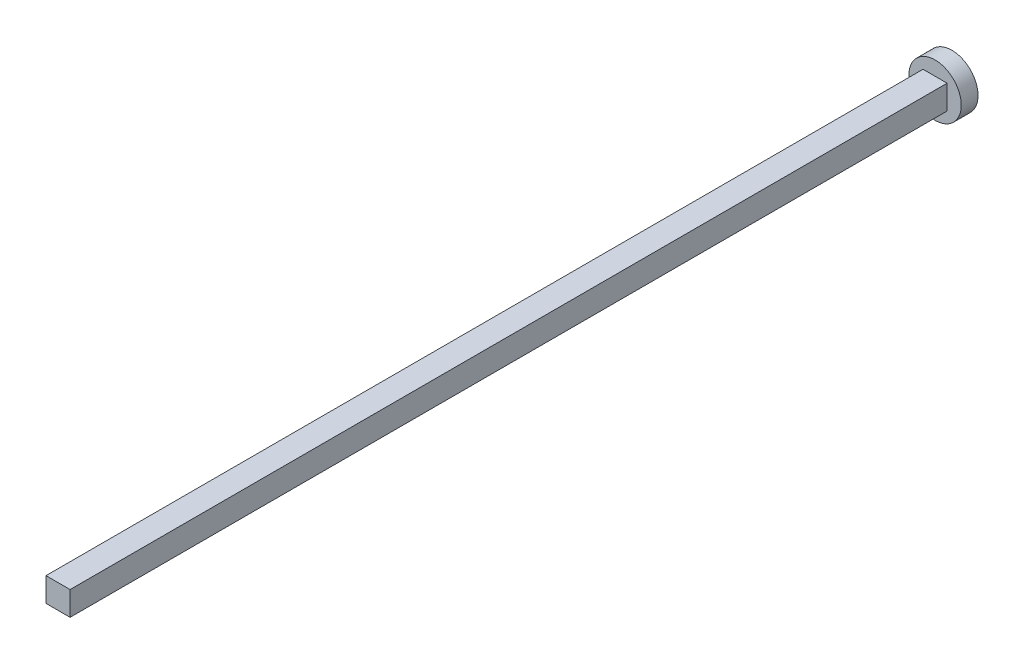
ISO-10303-21;
HEADER;
FILE_DESCRIPTION(('STEP AP214'),'2;1');
FILE_NAME('part.step','',(''),(''),'','','');
FILE_SCHEMA(('AUTOMOTIVE_DESIGN { 1 0 10303 214 1 1 1 1 }'));
ENDSEC;
DATA;
#1=APPLICATION_CONTEXT('core data for automotive mechanical design processes');
#2=APPLICATION_PROTOCOL_DEFINITION('international standard','automotive_design',2000,#1);
#3=PRODUCT_CONTEXT('',#1,'mechanical');
#4=PRODUCT('Part','Part','',(#3));
#5=PRODUCT_RELATED_PRODUCT_CATEGORY('part','',(#4));
#6=PRODUCT_DEFINITION_FORMATION('','',#4);
#7=PRODUCT_DEFINITION_CONTEXT('part definition',#1,'design');
#8=PRODUCT_DEFINITION('design','',#6,#7);
#9=PRODUCT_DEFINITION_SHAPE('','',#8);
#10=(LENGTH_UNIT() NAMED_UNIT(*) SI_UNIT(.MILLI.,.METRE.));
#11=(NAMED_UNIT(*) PLANE_ANGLE_UNIT() SI_UNIT($,.RADIAN.));
#12=(NAMED_UNIT(*) SI_UNIT($,.STERADIAN.) SOLID_ANGLE_UNIT());
#13=UNCERTAINTY_MEASURE_WITH_UNIT(LENGTH_MEASURE(1.E-05),#10,'distance_accuracy_value','');
#14=(GEOMETRIC_REPRESENTATION_CONTEXT(3) GLOBAL_UNCERTAINTY_ASSIGNED_CONTEXT((#13)) GLOBAL_UNIT_ASSIGNED_CONTEXT((#10,
#11,#12)) REPRESENTATION_CONTEXT('',''));
#15=CARTESIAN_POINT('',(0.,0.,0.));
#16=DIRECTION('',(0.,0.,1.));
#17=DIRECTION('',(1.,0.,0.));
#18=AXIS2_PLACEMENT_3D('',#15,#16,#17);
#19=CARTESIAN_POINT('',(1.43379802499999,-1.433798025,104.37));
#20=DIRECTION('',(-1.,0.,0.));
#21=DIRECTION('',(0.,0.,1.));
#22=AXIS2_PLACEMENT_3D('',#19,#20,#21);
#23=PLANE('',#22);
#24=DIRECTION('',(0.,1.,0.));
#25=VECTOR('',#24,1.);
#26=CARTESIAN_POINT('',(1.43379802499999,-1.433798025,0.));
#27=LINE('',#26,#25);
#28=CARTESIAN_POINT('',(1.43379802499999,-1.433798025,0.));
#29=VERTEX_POINT('',#28);
#30=CARTESIAN_POINT('',(1.43379802499999,1.433798025,0.));
#31=VERTEX_POINT('',#30);
#32=EDGE_CURVE('E77',#29,#31,#27,.T.);
#33=ORIENTED_EDGE('',*,*,#32,.T.);
#34=DIRECTION('',(0.,0.,-1.));
#35=VECTOR('',#34,1.);
#36=CARTESIAN_POINT('',(1.43379802499999,1.433798025,104.37));
#37=LINE('',#36,#35);
#38=CARTESIAN_POINT('',(1.43379802499999,1.433798025,104.37));
#39=VERTEX_POINT('',#38);
#40=EDGE_CURVE('E11',#39,#31,#37,.T.);
#41=ORIENTED_EDGE('',*,*,#40,.F.);
#42=DIRECTION('',(0.,1.,0.));
#43=VECTOR('',#42,1.);
#44=CARTESIAN_POINT('',(1.43379802499999,-1.433798025,104.37));
#45=LINE('',#44,#43);
#46=CARTESIAN_POINT('',(1.43379802499999,-1.433798025,104.37));
#47=VERTEX_POINT('',#46);
#48=EDGE_CURVE('E103',#47,#39,#45,.T.);
#49=ORIENTED_EDGE('',*,*,#48,.F.);
#50=DIRECTION('',(0.,0.,-1.));
#51=VECTOR('',#50,1.);
#52=CARTESIAN_POINT('',(1.43379802499999,-1.433798025,104.37));
#53=LINE('',#52,#51);
#54=EDGE_CURVE('E91',#47,#29,#53,.T.);
#55=ORIENTED_EDGE('',*,*,#54,.T.);
#56=EDGE_LOOP('',(#33,#41,#49,#55));
#57=FACE_BOUND('',#56,.T.);
#58=ADVANCED_FACE('F37',(#57),#23,.F.);
#59=CARTESIAN_POINT('',(-1.43379802499999,1.433798025,104.37));
#60=DIRECTION('',(0.,-1.,0.));
#61=DIRECTION('',(0.,0.,-1.));
#62=AXIS2_PLACEMENT_3D('',#59,#60,#61);
#63=PLANE('',#62);
#64=DIRECTION('',(-1.,0.,0.));
#65=VECTOR('',#64,1.);
#66=CARTESIAN_POINT('',(-1.43379802499999,1.433798025,0.));
#67=LINE('',#66,#65);
#68=CARTESIAN_POINT('',(-1.43379802499999,1.433798025,0.));
#69=VERTEX_POINT('',#68);
#70=EDGE_CURVE('E73',#31,#69,#67,.T.);
#71=ORIENTED_EDGE('',*,*,#70,.T.);
#72=DIRECTION('',(0.,0.,-1.));
#73=VECTOR('',#72,1.);
#74=CARTESIAN_POINT('',(-1.43379802499999,1.433798025,104.37));
#75=LINE('',#74,#73);
#76=CARTESIAN_POINT('',(-1.43379802499999,1.433798025,104.37));
#77=VERTEX_POINT('',#76);
#78=EDGE_CURVE('E45',#77,#69,#75,.T.);
#79=ORIENTED_EDGE('',*,*,#78,.F.);
#80=DIRECTION('',(-1.,0.,0.));
#81=VECTOR('',#80,1.);
#82=CARTESIAN_POINT('',(-1.43379802499999,1.433798025,104.37));
#83=LINE('',#82,#81);
#84=EDGE_CURVE('E87',#39,#77,#83,.T.);
#85=ORIENTED_EDGE('',*,*,#84,.F.);
#86=ORIENTED_EDGE('',*,*,#40,.T.);
#87=EDGE_LOOP('',(#71,#79,#85,#86));
#88=FACE_BOUND('',#87,.T.);
#89=ADVANCED_FACE('F86',(#88),#63,.F.);
#90=CARTESIAN_POINT('',(-1.43379802499999,-1.433798025,104.37));
#91=DIRECTION('',(1.,0.,0.));
#92=DIRECTION('',(0.,0.,-1.));
#93=AXIS2_PLACEMENT_3D('',#90,#91,#92);
#94=PLANE('',#93);
#95=DIRECTION('',(0.,-1.,0.));
#96=VECTOR('',#95,1.);
#97=CARTESIAN_POINT('',(-1.43379802499999,-1.433798025,0.));
#98=LINE('',#97,#96);
#99=CARTESIAN_POINT('',(-1.43379802499999,-1.433798025,0.));
#100=VERTEX_POINT('',#99);
#101=EDGE_CURVE('E80',#69,#100,#98,.T.);
#102=ORIENTED_EDGE('',*,*,#101,.T.);
#103=DIRECTION('',(0.,0.,-1.));
#104=VECTOR('',#103,1.);
#105=CARTESIAN_POINT('',(-1.43379802499999,-1.433798025,104.37));
#106=LINE('',#105,#104);
#107=CARTESIAN_POINT('',(-1.43379802499999,-1.433798025,104.37));
#108=VERTEX_POINT('',#107);
#109=EDGE_CURVE('E105',#108,#100,#106,.T.);
#110=ORIENTED_EDGE('',*,*,#109,.F.);
#111=DIRECTION('',(0.,-1.,0.));
#112=VECTOR('',#111,1.);
#113=CARTESIAN_POINT('',(-1.43379802499999,-1.433798025,104.37));
#114=LINE('',#113,#112);
#115=EDGE_CURVE('E111',#77,#108,#114,.T.);
#116=ORIENTED_EDGE('',*,*,#115,.F.);
#117=ORIENTED_EDGE('',*,*,#78,.T.);
#118=EDGE_LOOP('',(#102,#110,#116,#117));
#119=FACE_BOUND('',#118,.T.);
#120=ADVANCED_FACE('F109',(#119),#94,.F.);
#121=CARTESIAN_POINT('',(-1.43379802499999,-1.433798025,104.37));
#122=DIRECTION('',(0.,1.,0.));
#123=DIRECTION('',(0.,0.,1.));
#124=AXIS2_PLACEMENT_3D('',#121,#122,#123);
#125=PLANE('',#124);
#126=DIRECTION('',(1.,0.,0.));
#127=VECTOR('',#126,1.);
#128=CARTESIAN_POINT('',(-1.43379802499999,-1.433798025,0.));
#129=LINE('',#128,#127);
#130=EDGE_CURVE('E101',#100,#29,#129,.T.);
#131=ORIENTED_EDGE('',*,*,#130,.T.);
#132=ORIENTED_EDGE('',*,*,#54,.F.);
#133=DIRECTION('',(1.,0.,0.));
#134=VECTOR('',#133,1.);
#135=CARTESIAN_POINT('',(-1.43379802499999,-1.433798025,104.37));
#136=LINE('',#135,#134);
#137=EDGE_CURVE('E52',#108,#47,#136,.T.);
#138=ORIENTED_EDGE('',*,*,#137,.F.);
#139=ORIENTED_EDGE('',*,*,#109,.T.);
#140=EDGE_LOOP('',(#131,#132,#138,#139));
#141=FACE_BOUND('',#140,.T.);
#142=ADVANCED_FACE('F135',(#141),#125,.F.);
#143=CARTESIAN_POINT('',(0.,0.,104.37));
#144=DIRECTION('',(0.,0.,-1.));
#145=DIRECTION('',(-1.,0.,0.));
#146=AXIS2_PLACEMENT_3D('',#143,#144,#145);
#147=PLANE('',#146);
#148=ORIENTED_EDGE('',*,*,#48,.T.);
#149=ORIENTED_EDGE('',*,*,#84,.T.);
#150=ORIENTED_EDGE('',*,*,#115,.T.);
#151=ORIENTED_EDGE('',*,*,#137,.T.);
#152=EDGE_LOOP('',(#148,#149,#150,#151));
#153=FACE_BOUND('',#152,.T.);
#154=ADVANCED_FACE('F140',(#153),#147,.F.);
#155=CARTESIAN_POINT('',(0.,0.,-2.));
#156=DIRECTION('',(0.,0.,1.));
#157=DIRECTION('',(1.,0.,0.));
#158=AXIS2_PLACEMENT_3D('',#155,#156,#157);
#159=CYLINDRICAL_SURFACE('',#158,3.11618763072831);
#160=CARTESIAN_POINT('',(0.,0.,-2.));
#161=DIRECTION('',(0.,0.,-1.));
#162=DIRECTION('',(-1.,0.,0.));
#163=AXIS2_PLACEMENT_3D('',#160,#161,#162);
#164=CIRCLE('',#163,3.11618763072831);
#165=CARTESIAN_POINT('',(-3.11618763072831,0.,-2.));
#166=VERTEX_POINT('',#165);
#167=EDGE_CURVE('E92',#166,#166,#164,.T.);
#168=ORIENTED_EDGE('',*,*,#167,.F.);
#169=EDGE_LOOP('',(#168));
#170=FACE_BOUND('',#169,.T.);
#171=CARTESIAN_POINT('',(0.,0.,0.));
#172=DIRECTION('',(0.,0.,-1.));
#173=DIRECTION('',(-1.,0.,0.));
#174=AXIS2_PLACEMENT_3D('',#171,#172,#173);
#175=CIRCLE('',#174,3.11618763072831);
#176=CARTESIAN_POINT('',(-3.11618763072831,0.,0.));
#177=VERTEX_POINT('',#176);
#178=EDGE_CURVE('E95',#177,#177,#175,.T.);
#179=ORIENTED_EDGE('',*,*,#178,.T.);
#180=EDGE_LOOP('',(#179));
#181=FACE_BOUND('',#180,.T.);
#182=ADVANCED_FACE('F118',(#170,#181),#159,.T.);
#183=CARTESIAN_POINT('',(0.,0.,-2.));
#184=DIRECTION('',(0.,0.,-1.));
#185=DIRECTION('',(-1.,0.,0.));
#186=AXIS2_PLACEMENT_3D('',#183,#184,#185);
#187=PLANE('',#186);
#188=ORIENTED_EDGE('',*,*,#167,.T.);
#189=EDGE_LOOP('',(#188));
#190=FACE_BOUND('',#189,.T.);
#191=ADVANCED_FACE('F120',(#190),#187,.T.);
#192=CARTESIAN_POINT('',(0.,0.,0.));
#193=DIRECTION('',(0.,0.,-1.));
#194=DIRECTION('',(-1.,0.,0.));
#195=AXIS2_PLACEMENT_3D('',#192,#193,#194);
#196=PLANE('',#195);
#197=ORIENTED_EDGE('',*,*,#32,.F.);
#198=ORIENTED_EDGE('',*,*,#130,.F.);
#199=ORIENTED_EDGE('',*,*,#101,.F.);
#200=ORIENTED_EDGE('',*,*,#70,.F.);
#201=EDGE_LOOP('',(#197,#198,#199,#200));
#202=FACE_BOUND('',#201,.T.);
#203=ORIENTED_EDGE('',*,*,#178,.F.);
#204=EDGE_LOOP('',(#203));
#205=FACE_BOUND('',#204,.T.);
#206=ADVANCED_FACE('F74',(#202,#205),#196,.F.);
#207=CLOSED_SHELL('',(#58,#89,#120,#142,#154,#182,#191,#206));
#208=MANIFOLD_SOLID_BREP('B2',#207);
#209=ADVANCED_BREP_SHAPE_REPRESENTATION('',(#18,#208),#14);
#210=SHAPE_DEFINITION_REPRESENTATION(#9,#209);
ENDSEC;
END-ISO-10303-21;
